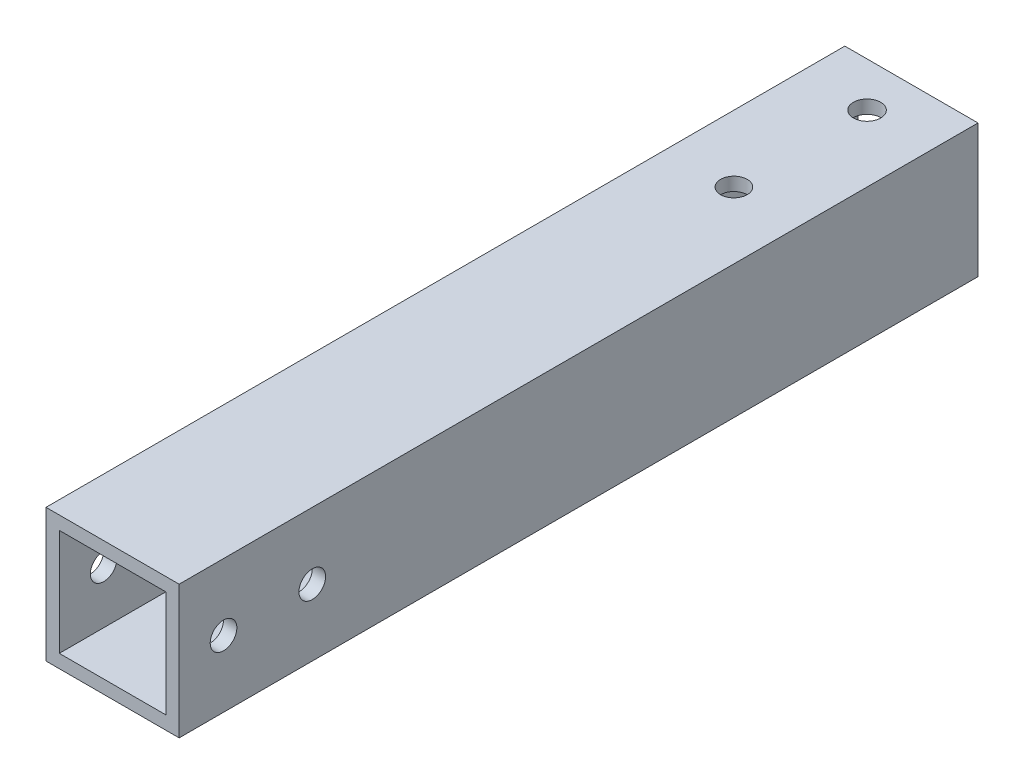
ISO-10303-21;
HEADER;
FILE_DESCRIPTION(('STEP AP214'),'2;1');
FILE_NAME('part.step','',(''),(''),'','','');
FILE_SCHEMA(('AUTOMOTIVE_DESIGN { 1 0 10303 214 1 1 1 1 }'));
ENDSEC;
DATA;
#1=APPLICATION_CONTEXT('core data for automotive mechanical design processes');
#2=APPLICATION_PROTOCOL_DEFINITION('international standard','automotive_design',2000,#1);
#3=PRODUCT_CONTEXT('',#1,'mechanical');
#4=PRODUCT('Part','Part','',(#3));
#5=PRODUCT_RELATED_PRODUCT_CATEGORY('part','',(#4));
#6=PRODUCT_DEFINITION_FORMATION('','',#4);
#7=PRODUCT_DEFINITION_CONTEXT('part definition',#1,'design');
#8=PRODUCT_DEFINITION('design','',#6,#7);
#9=PRODUCT_DEFINITION_SHAPE('','',#8);
#10=(LENGTH_UNIT() NAMED_UNIT(*) SI_UNIT(.MILLI.,.METRE.));
#11=(NAMED_UNIT(*) PLANE_ANGLE_UNIT() SI_UNIT($,.RADIAN.));
#12=(NAMED_UNIT(*) SI_UNIT($,.STERADIAN.) SOLID_ANGLE_UNIT());
#13=UNCERTAINTY_MEASURE_WITH_UNIT(LENGTH_MEASURE(1.E-05),#10,'distance_accuracy_value','');
#14=(GEOMETRIC_REPRESENTATION_CONTEXT(3) GLOBAL_UNCERTAINTY_ASSIGNED_CONTEXT((#13)) GLOBAL_UNIT_ASSIGNED_CONTEXT((#10,
#11,#12)) REPRESENTATION_CONTEXT('',''));
#15=CARTESIAN_POINT('',(0.,0.,0.));
#16=DIRECTION('',(0.,0.,1.));
#17=DIRECTION('',(1.,0.,0.));
#18=AXIS2_PLACEMENT_3D('',#15,#16,#17);
#19=CARTESIAN_POINT('',(7.5,-7.49999999999999,90.));
#20=DIRECTION('',(-1.,0.,0.));
#21=DIRECTION('',(0.,0.,1.));
#22=AXIS2_PLACEMENT_3D('',#19,#20,#21);
#23=PLANE('',#22);
#24=CARTESIAN_POINT('',(7.5,0.,75.));
#25=DIRECTION('',(1.,0.,0.));
#26=DIRECTION('',(0.,0.,-1.));
#27=AXIS2_PLACEMENT_3D('',#24,#25,#26);
#28=CIRCLE('',#27,1.5);
#29=CARTESIAN_POINT('',(7.5,0.,73.5));
#30=VERTEX_POINT('',#29);
#31=EDGE_CURVE('E176',#30,#30,#28,.T.);
#32=ORIENTED_EDGE('',*,*,#31,.F.);
#33=EDGE_LOOP('',(#32));
#34=FACE_BOUND('',#33,.T.);
#35=CARTESIAN_POINT('',(7.5,0.,85.));
#36=DIRECTION('',(1.,0.,0.));
#37=DIRECTION('',(0.,0.,-1.));
#38=AXIS2_PLACEMENT_3D('',#35,#36,#37);
#39=CIRCLE('',#38,1.5);
#40=CARTESIAN_POINT('',(7.5,0.,83.5));
#41=VERTEX_POINT('',#40);
#42=EDGE_CURVE('E195',#41,#41,#39,.T.);
#43=ORIENTED_EDGE('',*,*,#42,.F.);
#44=EDGE_LOOP('',(#43));
#45=FACE_BOUND('',#44,.T.);
#46=DIRECTION('',(0.,1.,0.));
#47=VECTOR('',#46,1.);
#48=CARTESIAN_POINT('',(7.5,-7.49999999999999,0.));
#49=LINE('',#48,#47);
#50=CARTESIAN_POINT('',(7.5,-7.49999999999999,0.));
#51=VERTEX_POINT('',#50);
#52=CARTESIAN_POINT('',(7.5,7.50000000000001,0.));
#53=VERTEX_POINT('',#52);
#54=EDGE_CURVE('E132',#51,#53,#49,.T.);
#55=ORIENTED_EDGE('',*,*,#54,.T.);
#56=DIRECTION('',(0.,0.,-1.));
#57=VECTOR('',#56,1.);
#58=CARTESIAN_POINT('',(7.5,7.50000000000001,90.));
#59=LINE('',#58,#57);
#60=CARTESIAN_POINT('',(7.5,7.50000000000001,90.));
#61=VERTEX_POINT('',#60);
#62=EDGE_CURVE('E11',#61,#53,#59,.T.);
#63=ORIENTED_EDGE('',*,*,#62,.F.);
#64=DIRECTION('',(0.,1.,0.));
#65=VECTOR('',#64,1.);
#66=CARTESIAN_POINT('',(7.5,-7.49999999999999,90.));
#67=LINE('',#66,#65);
#68=CARTESIAN_POINT('',(7.5,-7.49999999999999,90.));
#69=VERTEX_POINT('',#68);
#70=EDGE_CURVE('E136',#69,#61,#67,.T.);
#71=ORIENTED_EDGE('',*,*,#70,.F.);
#72=DIRECTION('',(0.,0.,-1.));
#73=VECTOR('',#72,1.);
#74=CARTESIAN_POINT('',(7.5,-7.49999999999999,90.));
#75=LINE('',#74,#73);
#76=EDGE_CURVE('E146',#69,#51,#75,.T.);
#77=ORIENTED_EDGE('',*,*,#76,.T.);
#78=EDGE_LOOP('',(#55,#63,#71,#77));
#79=FACE_BOUND('',#78,.T.);
#80=ADVANCED_FACE('F30',(#34,#45,#79),#23,.F.);
#81=CARTESIAN_POINT('',(-7.5,7.50000000000001,90.));
#82=DIRECTION('',(0.,-1.,0.));
#83=DIRECTION('',(0.,0.,-1.));
#84=AXIS2_PLACEMENT_3D('',#81,#82,#83);
#85=PLANE('',#84);
#86=CARTESIAN_POINT('',(1.85615411929518E-13,7.50000000000001,4.99999999999972));
#87=DIRECTION('',(0.,1.,0.));
#88=DIRECTION('',(0.,0.,1.));
#89=AXIS2_PLACEMENT_3D('',#86,#87,#88);
#90=CIRCLE('',#89,1.53877849812308);
#91=CARTESIAN_POINT('',(1.85615411929518E-13,7.50000000000001,6.5387784981228));
#92=VERTEX_POINT('',#91);
#93=EDGE_CURVE('E286',#92,#92,#90,.T.);
#94=ORIENTED_EDGE('',*,*,#93,.F.);
#95=EDGE_LOOP('',(#94));
#96=FACE_BOUND('',#95,.T.);
#97=CARTESIAN_POINT('',(1.82145964977565E-13,7.50000000000001,19.9999999999997));
#98=DIRECTION('',(0.,1.,0.));
#99=DIRECTION('',(0.,0.,1.));
#100=AXIS2_PLACEMENT_3D('',#97,#98,#99);
#101=CIRCLE('',#100,1.5);
#102=CARTESIAN_POINT('',(1.82145964977565E-13,7.50000000000001,21.4999999999997));
#103=VERTEX_POINT('',#102);
#104=EDGE_CURVE('E179',#103,#103,#101,.T.);
#105=ORIENTED_EDGE('',*,*,#104,.F.);
#106=EDGE_LOOP('',(#105));
#107=FACE_BOUND('',#106,.T.);
#108=DIRECTION('',(-1.,0.,0.));
#109=VECTOR('',#108,1.);
#110=CARTESIAN_POINT('',(-7.5,7.50000000000001,0.));
#111=LINE('',#110,#109);
#112=CARTESIAN_POINT('',(-7.5,7.50000000000001,0.));
#113=VERTEX_POINT('',#112);
#114=EDGE_CURVE('E149',#53,#113,#111,.T.);
#115=ORIENTED_EDGE('',*,*,#114,.T.);
#116=DIRECTION('',(0.,0.,-1.));
#117=VECTOR('',#116,1.);
#118=CARTESIAN_POINT('',(-7.5,7.50000000000001,90.));
#119=LINE('',#118,#117);
#120=CARTESIAN_POINT('',(-7.5,7.50000000000001,90.));
#121=VERTEX_POINT('',#120);
#122=EDGE_CURVE('E38',#121,#113,#119,.T.);
#123=ORIENTED_EDGE('',*,*,#122,.F.);
#124=DIRECTION('',(-1.,0.,0.));
#125=VECTOR('',#124,1.);
#126=CARTESIAN_POINT('',(-7.5,7.50000000000001,90.));
#127=LINE('',#126,#125);
#128=EDGE_CURVE('E139',#61,#121,#127,.T.);
#129=ORIENTED_EDGE('',*,*,#128,.F.);
#130=ORIENTED_EDGE('',*,*,#62,.T.);
#131=EDGE_LOOP('',(#115,#123,#129,#130));
#132=FACE_BOUND('',#131,.T.);
#133=ADVANCED_FACE('F205',(#96,#107,#132),#85,.F.);
#134=CARTESIAN_POINT('',(-7.5,-7.49999999999999,90.));
#135=DIRECTION('',(1.,0.,0.));
#136=DIRECTION('',(0.,0.,-1.));
#137=AXIS2_PLACEMENT_3D('',#134,#135,#136);
#138=PLANE('',#137);
#139=CARTESIAN_POINT('',(-7.5,0.,75.));
#140=DIRECTION('',(1.,0.,0.));
#141=DIRECTION('',(0.,0.,-1.));
#142=AXIS2_PLACEMENT_3D('',#139,#140,#141);
#143=CIRCLE('',#142,1.5);
#144=CARTESIAN_POINT('',(-7.5,0.,73.5));
#145=VERTEX_POINT('',#144);
#146=EDGE_CURVE('E168',#145,#145,#143,.T.);
#147=ORIENTED_EDGE('',*,*,#146,.T.);
#148=EDGE_LOOP('',(#147));
#149=FACE_BOUND('',#148,.T.);
#150=CARTESIAN_POINT('',(-7.5,0.,85.));
#151=DIRECTION('',(1.,0.,0.));
#152=DIRECTION('',(0.,0.,-1.));
#153=AXIS2_PLACEMENT_3D('',#150,#151,#152);
#154=CIRCLE('',#153,1.5);
#155=CARTESIAN_POINT('',(-7.5,0.,83.5));
#156=VERTEX_POINT('',#155);
#157=EDGE_CURVE('E164',#156,#156,#154,.T.);
#158=ORIENTED_EDGE('',*,*,#157,.T.);
#159=EDGE_LOOP('',(#158));
#160=FACE_BOUND('',#159,.T.);
#161=DIRECTION('',(0.,-1.,0.));
#162=VECTOR('',#161,1.);
#163=CARTESIAN_POINT('',(-7.5,-7.49999999999999,0.));
#164=LINE('',#163,#162);
#165=CARTESIAN_POINT('',(-7.5,-7.49999999999999,0.));
#166=VERTEX_POINT('',#165);
#167=EDGE_CURVE('E151',#113,#166,#164,.T.);
#168=ORIENTED_EDGE('',*,*,#167,.T.);
#169=DIRECTION('',(0.,0.,-1.));
#170=VECTOR('',#169,1.);
#171=CARTESIAN_POINT('',(-7.5,-7.49999999999999,90.));
#172=LINE('',#171,#170);
#173=CARTESIAN_POINT('',(-7.5,-7.49999999999999,90.));
#174=VERTEX_POINT('',#173);
#175=EDGE_CURVE('E156',#174,#166,#172,.T.);
#176=ORIENTED_EDGE('',*,*,#175,.F.);
#177=DIRECTION('',(0.,-1.,0.));
#178=VECTOR('',#177,1.);
#179=CARTESIAN_POINT('',(-7.5,-7.49999999999999,90.));
#180=LINE('',#179,#178);
#181=EDGE_CURVE('E142',#121,#174,#180,.T.);
#182=ORIENTED_EDGE('',*,*,#181,.F.);
#183=ORIENTED_EDGE('',*,*,#122,.T.);
#184=EDGE_LOOP('',(#168,#176,#182,#183));
#185=FACE_BOUND('',#184,.T.);
#186=ADVANCED_FACE('F223',(#149,#160,#185),#138,.F.);
#187=CARTESIAN_POINT('',(-7.5,-7.49999999999999,90.));
#188=DIRECTION('',(0.,1.,0.));
#189=DIRECTION('',(0.,0.,1.));
#190=AXIS2_PLACEMENT_3D('',#187,#188,#189);
#191=PLANE('',#190);
#192=CARTESIAN_POINT('',(1.85615411929518E-13,-7.49999999999999,4.99999999999972));
#193=DIRECTION('',(0.,1.,0.));
#194=DIRECTION('',(0.,0.,1.));
#195=AXIS2_PLACEMENT_3D('',#192,#193,#194);
#196=CIRCLE('',#195,1.53877849812308);
#197=CARTESIAN_POINT('',(1.85615411929518E-13,-7.49999999999999,6.5387784981228));
#198=VERTEX_POINT('',#197);
#199=EDGE_CURVE('E281',#198,#198,#196,.T.);
#200=ORIENTED_EDGE('',*,*,#199,.T.);
#201=EDGE_LOOP('',(#200));
#202=FACE_BOUND('',#201,.T.);
#203=CARTESIAN_POINT('',(1.82145964977565E-13,-7.49999999999999,19.9999999999997));
#204=DIRECTION('',(0.,1.,0.));
#205=DIRECTION('',(0.,0.,1.));
#206=AXIS2_PLACEMENT_3D('',#203,#204,#205);
#207=CIRCLE('',#206,1.5);
#208=CARTESIAN_POINT('',(1.82145964977565E-13,-7.49999999999999,21.4999999999997));
#209=VERTEX_POINT('',#208);
#210=EDGE_CURVE('E172',#209,#209,#207,.T.);
#211=ORIENTED_EDGE('',*,*,#210,.T.);
#212=EDGE_LOOP('',(#211));
#213=FACE_BOUND('',#212,.T.);
#214=DIRECTION('',(1.,0.,0.));
#215=VECTOR('',#214,1.);
#216=CARTESIAN_POINT('',(-7.5,-7.49999999999999,0.));
#217=LINE('',#216,#215);
#218=EDGE_CURVE('E140',#166,#51,#217,.T.);
#219=ORIENTED_EDGE('',*,*,#218,.T.);
#220=ORIENTED_EDGE('',*,*,#76,.F.);
#221=DIRECTION('',(1.,0.,0.));
#222=VECTOR('',#221,1.);
#223=CARTESIAN_POINT('',(-7.5,-7.49999999999999,90.));
#224=LINE('',#223,#222);
#225=EDGE_CURVE('E144',#174,#69,#224,.T.);
#226=ORIENTED_EDGE('',*,*,#225,.F.);
#227=ORIENTED_EDGE('',*,*,#175,.T.);
#228=EDGE_LOOP('',(#219,#220,#226,#227));
#229=FACE_BOUND('',#228,.T.);
#230=ADVANCED_FACE('F221',(#202,#213,#229),#191,.F.);
#231=CARTESIAN_POINT('',(7.5,7.50000000000001,90.));
#232=DIRECTION('',(0.,0.,-1.));
#233=DIRECTION('',(-1.,0.,0.));
#234=AXIS2_PLACEMENT_3D('',#231,#232,#233);
#235=PLANE('',#234);
#236=DIRECTION('',(-1.,0.,0.));
#237=VECTOR('',#236,1.);
#238=CARTESIAN_POINT('',(-6.,6.00000000000001,90.));
#239=LINE('',#238,#237);
#240=CARTESIAN_POINT('',(6.,6.00000000000001,90.));
#241=VERTEX_POINT('',#240);
#242=CARTESIAN_POINT('',(-6.,6.00000000000001,90.));
#243=VERTEX_POINT('',#242);
#244=EDGE_CURVE('E126',#241,#243,#239,.T.);
#245=ORIENTED_EDGE('',*,*,#244,.F.);
#246=DIRECTION('',(0.,1.,0.));
#247=VECTOR('',#246,1.);
#248=CARTESIAN_POINT('',(6.,-6.00000000000001,90.));
#249=LINE('',#248,#247);
#250=CARTESIAN_POINT('',(6.,-6.00000000000001,90.));
#251=VERTEX_POINT('',#250);
#252=EDGE_CURVE('E46',#251,#241,#249,.T.);
#253=ORIENTED_EDGE('',*,*,#252,.F.);
#254=DIRECTION('',(1.,0.,0.));
#255=VECTOR('',#254,1.);
#256=CARTESIAN_POINT('',(-6.,-6.00000000000001,90.));
#257=LINE('',#256,#255);
#258=CARTESIAN_POINT('',(-6.,-6.00000000000001,90.));
#259=VERTEX_POINT('',#258);
#260=EDGE_CURVE('E114',#259,#251,#257,.T.);
#261=ORIENTED_EDGE('',*,*,#260,.F.);
#262=DIRECTION('',(0.,-1.,0.));
#263=VECTOR('',#262,1.);
#264=CARTESIAN_POINT('',(-6.,-6.00000000000001,90.));
#265=LINE('',#264,#263);
#266=EDGE_CURVE('E117',#243,#259,#265,.T.);
#267=ORIENTED_EDGE('',*,*,#266,.F.);
#268=EDGE_LOOP('',(#245,#253,#261,#267));
#269=FACE_BOUND('',#268,.T.);
#270=ORIENTED_EDGE('',*,*,#70,.T.);
#271=ORIENTED_EDGE('',*,*,#128,.T.);
#272=ORIENTED_EDGE('',*,*,#181,.T.);
#273=ORIENTED_EDGE('',*,*,#225,.T.);
#274=EDGE_LOOP('',(#270,#271,#272,#273));
#275=FACE_BOUND('',#274,.T.);
#276=ADVANCED_FACE('F217',(#269,#275),#235,.F.);
#277=CARTESIAN_POINT('',(7.5,7.50000000000001,0.));
#278=DIRECTION('',(0.,0.,-1.));
#279=DIRECTION('',(-1.,0.,0.));
#280=AXIS2_PLACEMENT_3D('',#277,#278,#279);
#281=PLANE('',#280);
#282=DIRECTION('',(0.,1.,0.));
#283=VECTOR('',#282,1.);
#284=CARTESIAN_POINT('',(6.,-6.00000000000001,0.));
#285=LINE('',#284,#283);
#286=CARTESIAN_POINT('',(6.,-6.00000000000001,0.));
#287=VERTEX_POINT('',#286);
#288=CARTESIAN_POINT('',(6.,6.00000000000001,0.));
#289=VERTEX_POINT('',#288);
#290=EDGE_CURVE('E98',#287,#289,#285,.T.);
#291=ORIENTED_EDGE('',*,*,#290,.T.);
#292=DIRECTION('',(-1.,0.,0.));
#293=VECTOR('',#292,1.);
#294=CARTESIAN_POINT('',(-6.,6.00000000000001,0.));
#295=LINE('',#294,#293);
#296=CARTESIAN_POINT('',(-6.,6.00000000000001,0.));
#297=VERTEX_POINT('',#296);
#298=EDGE_CURVE('E107',#289,#297,#295,.T.);
#299=ORIENTED_EDGE('',*,*,#298,.T.);
#300=DIRECTION('',(0.,-1.,0.));
#301=VECTOR('',#300,1.);
#302=CARTESIAN_POINT('',(-6.,-6.00000000000001,0.));
#303=LINE('',#302,#301);
#304=CARTESIAN_POINT('',(-6.,-6.00000000000001,0.));
#305=VERTEX_POINT('',#304);
#306=EDGE_CURVE('E54',#297,#305,#303,.T.);
#307=ORIENTED_EDGE('',*,*,#306,.T.);
#308=DIRECTION('',(1.,0.,0.));
#309=VECTOR('',#308,1.);
#310=CARTESIAN_POINT('',(-6.,-6.00000000000001,0.));
#311=LINE('',#310,#309);
#312=EDGE_CURVE('E104',#305,#287,#311,.T.);
#313=ORIENTED_EDGE('',*,*,#312,.T.);
#314=EDGE_LOOP('',(#291,#299,#307,#313));
#315=FACE_BOUND('',#314,.T.);
#316=ORIENTED_EDGE('',*,*,#54,.F.);
#317=ORIENTED_EDGE('',*,*,#218,.F.);
#318=ORIENTED_EDGE('',*,*,#167,.F.);
#319=ORIENTED_EDGE('',*,*,#114,.F.);
#320=EDGE_LOOP('',(#316,#317,#318,#319));
#321=FACE_BOUND('',#320,.T.);
#322=ADVANCED_FACE('F111',(#315,#321),#281,.T.);
#323=CARTESIAN_POINT('',(6.,-6.00000000000001,0.));
#324=DIRECTION('',(1.,0.,0.));
#325=DIRECTION('',(0.,0.,-1.));
#326=AXIS2_PLACEMENT_3D('',#323,#324,#325);
#327=PLANE('',#326);
#328=CARTESIAN_POINT('',(6.,0.,75.));
#329=DIRECTION('',(1.,0.,0.));
#330=DIRECTION('',(0.,0.,-1.));
#331=AXIS2_PLACEMENT_3D('',#328,#329,#330);
#332=CIRCLE('',#331,1.5);
#333=CARTESIAN_POINT('',(6.,0.,73.5));
#334=VERTEX_POINT('',#333);
#335=EDGE_CURVE('E167',#334,#334,#332,.T.);
#336=ORIENTED_EDGE('',*,*,#335,.T.);
#337=EDGE_LOOP('',(#336));
#338=FACE_BOUND('',#337,.T.);
#339=CARTESIAN_POINT('',(6.,0.,85.));
#340=DIRECTION('',(1.,0.,0.));
#341=DIRECTION('',(0.,0.,-1.));
#342=AXIS2_PLACEMENT_3D('',#339,#340,#341);
#343=CIRCLE('',#342,1.5);
#344=CARTESIAN_POINT('',(6.,0.,83.5));
#345=VERTEX_POINT('',#344);
#346=EDGE_CURVE('E120',#345,#345,#343,.T.);
#347=ORIENTED_EDGE('',*,*,#346,.T.);
#348=EDGE_LOOP('',(#347));
#349=FACE_BOUND('',#348,.T.);
#350=ORIENTED_EDGE('',*,*,#252,.T.);
#351=DIRECTION('',(0.,0.,1.));
#352=VECTOR('',#351,1.);
#353=CARTESIAN_POINT('',(6.,6.00000000000001,0.));
#354=LINE('',#353,#352);
#355=EDGE_CURVE('E94',#289,#241,#354,.T.);
#356=ORIENTED_EDGE('',*,*,#355,.F.);
#357=ORIENTED_EDGE('',*,*,#290,.F.);
#358=DIRECTION('',(0.,0.,1.));
#359=VECTOR('',#358,1.);
#360=CARTESIAN_POINT('',(6.,-6.00000000000001,0.));
#361=LINE('',#360,#359);
#362=EDGE_CURVE('E130',#287,#251,#361,.T.);
#363=ORIENTED_EDGE('',*,*,#362,.T.);
#364=EDGE_LOOP('',(#350,#356,#357,#363));
#365=FACE_BOUND('',#364,.T.);
#366=ADVANCED_FACE('F96',(#338,#349,#365),#327,.F.);
#367=CARTESIAN_POINT('',(-6.,-6.00000000000001,0.));
#368=DIRECTION('',(0.,-1.,0.));
#369=DIRECTION('',(0.,0.,-1.));
#370=AXIS2_PLACEMENT_3D('',#367,#368,#369);
#371=PLANE('',#370);
#372=CARTESIAN_POINT('',(1.85615411929518E-13,-6.00000000000001,4.99999999999972));
#373=DIRECTION('',(0.,-1.,0.));
#374=DIRECTION('',(0.,0.,-1.));
#375=AXIS2_PLACEMENT_3D('',#372,#373,#374);
#376=CIRCLE('',#375,1.53877849812308);
#377=CARTESIAN_POINT('',(1.85615411929518E-13,-6.00000000000001,3.46122150187664));
#378=VERTEX_POINT('',#377);
#379=EDGE_CURVE('E184',#378,#378,#376,.T.);
#380=ORIENTED_EDGE('',*,*,#379,.T.);
#381=EDGE_LOOP('',(#380));
#382=FACE_BOUND('',#381,.T.);
#383=CARTESIAN_POINT('',(1.82145964977565E-13,-6.00000000000001,19.9999999999997));
#384=DIRECTION('',(0.,-1.,0.));
#385=DIRECTION('',(0.,0.,-1.));
#386=AXIS2_PLACEMENT_3D('',#383,#384,#385);
#387=CIRCLE('',#386,1.5);
#388=CARTESIAN_POINT('',(1.82145964977565E-13,-6.00000000000001,18.4999999999997));
#389=VERTEX_POINT('',#388);
#390=EDGE_CURVE('E171',#389,#389,#387,.T.);
#391=ORIENTED_EDGE('',*,*,#390,.T.);
#392=EDGE_LOOP('',(#391));
#393=FACE_BOUND('',#392,.T.);
#394=ORIENTED_EDGE('',*,*,#260,.T.);
#395=ORIENTED_EDGE('',*,*,#362,.F.);
#396=ORIENTED_EDGE('',*,*,#312,.F.);
#397=DIRECTION('',(0.,0.,1.));
#398=VECTOR('',#397,1.);
#399=CARTESIAN_POINT('',(-6.,-6.00000000000001,0.));
#400=LINE('',#399,#398);
#401=EDGE_CURVE('E133',#305,#259,#400,.T.);
#402=ORIENTED_EDGE('',*,*,#401,.T.);
#403=EDGE_LOOP('',(#394,#395,#396,#402));
#404=FACE_BOUND('',#403,.T.);
#405=ADVANCED_FACE('F245',(#382,#393,#404),#371,.F.);
#406=CARTESIAN_POINT('',(-6.,-6.00000000000001,0.));
#407=DIRECTION('',(-1.,0.,0.));
#408=DIRECTION('',(0.,0.,1.));
#409=AXIS2_PLACEMENT_3D('',#406,#407,#408);
#410=PLANE('',#409);
#411=CARTESIAN_POINT('',(-6.,0.,75.));
#412=DIRECTION('',(-1.,0.,0.));
#413=DIRECTION('',(0.,0.,1.));
#414=AXIS2_PLACEMENT_3D('',#411,#412,#413);
#415=CIRCLE('',#414,1.5);
#416=CARTESIAN_POINT('',(-6.,0.,76.5));
#417=VERTEX_POINT('',#416);
#418=EDGE_CURVE('E165',#417,#417,#415,.T.);
#419=ORIENTED_EDGE('',*,*,#418,.T.);
#420=EDGE_LOOP('',(#419));
#421=FACE_BOUND('',#420,.T.);
#422=CARTESIAN_POINT('',(-6.,0.,85.));
#423=DIRECTION('',(-1.,0.,0.));
#424=DIRECTION('',(0.,0.,1.));
#425=AXIS2_PLACEMENT_3D('',#422,#423,#424);
#426=CIRCLE('',#425,1.5);
#427=CARTESIAN_POINT('',(-6.,0.,86.5));
#428=VERTEX_POINT('',#427);
#429=EDGE_CURVE('E161',#428,#428,#426,.T.);
#430=ORIENTED_EDGE('',*,*,#429,.T.);
#431=EDGE_LOOP('',(#430));
#432=FACE_BOUND('',#431,.T.);
#433=ORIENTED_EDGE('',*,*,#266,.T.);
#434=ORIENTED_EDGE('',*,*,#401,.F.);
#435=ORIENTED_EDGE('',*,*,#306,.F.);
#436=DIRECTION('',(0.,0.,1.));
#437=VECTOR('',#436,1.);
#438=CARTESIAN_POINT('',(-6.,6.00000000000001,0.));
#439=LINE('',#438,#437);
#440=EDGE_CURVE('E103',#297,#243,#439,.T.);
#441=ORIENTED_EDGE('',*,*,#440,.T.);
#442=EDGE_LOOP('',(#433,#434,#435,#441));
#443=FACE_BOUND('',#442,.T.);
#444=ADVANCED_FACE('F250',(#421,#432,#443),#410,.F.);
#445=CARTESIAN_POINT('',(-6.,6.00000000000001,0.));
#446=DIRECTION('',(0.,1.,0.));
#447=DIRECTION('',(0.,0.,1.));
#448=AXIS2_PLACEMENT_3D('',#445,#446,#447);
#449=PLANE('',#448);
#450=CARTESIAN_POINT('',(1.85615411929518E-13,6.00000000000001,4.99999999999972));
#451=DIRECTION('',(0.,1.,0.));
#452=DIRECTION('',(0.,0.,1.));
#453=AXIS2_PLACEMENT_3D('',#450,#451,#452);
#454=CIRCLE('',#453,1.53877849812308);
#455=CARTESIAN_POINT('',(1.85615411929518E-13,6.00000000000001,6.5387784981228));
#456=VERTEX_POINT('',#455);
#457=EDGE_CURVE('E33',#456,#456,#454,.T.);
#458=ORIENTED_EDGE('',*,*,#457,.T.);
#459=EDGE_LOOP('',(#458));
#460=FACE_BOUND('',#459,.T.);
#461=CARTESIAN_POINT('',(1.82145964977565E-13,6.00000000000001,19.9999999999997));
#462=DIRECTION('',(0.,1.,0.));
#463=DIRECTION('',(0.,0.,1.));
#464=AXIS2_PLACEMENT_3D('',#461,#462,#463);
#465=CIRCLE('',#464,1.5);
#466=CARTESIAN_POINT('',(1.82145964977565E-13,6.00000000000001,21.4999999999997));
#467=VERTEX_POINT('',#466);
#468=EDGE_CURVE('E169',#467,#467,#465,.T.);
#469=ORIENTED_EDGE('',*,*,#468,.T.);
#470=EDGE_LOOP('',(#469));
#471=FACE_BOUND('',#470,.T.);
#472=ORIENTED_EDGE('',*,*,#244,.T.);
#473=ORIENTED_EDGE('',*,*,#440,.F.);
#474=ORIENTED_EDGE('',*,*,#298,.F.);
#475=ORIENTED_EDGE('',*,*,#355,.T.);
#476=EDGE_LOOP('',(#472,#473,#474,#475));
#477=FACE_BOUND('',#476,.T.);
#478=ADVANCED_FACE('F108',(#460,#471,#477),#449,.F.);
#479=CARTESIAN_POINT('',(-7.5,0.,85.));
#480=DIRECTION('',(1.,0.,0.));
#481=DIRECTION('',(0.,0.,-1.));
#482=AXIS2_PLACEMENT_3D('',#479,#480,#481);
#483=CYLINDRICAL_SURFACE('',#482,1.5);
#484=ORIENTED_EDGE('',*,*,#157,.F.);
#485=EDGE_LOOP('',(#484));
#486=FACE_BOUND('',#485,.T.);
#487=ORIENTED_EDGE('',*,*,#429,.F.);
#488=EDGE_LOOP('',(#487));
#489=FACE_BOUND('',#488,.T.);
#490=ADVANCED_FACE('F249',(#486,#489),#483,.F.);
#491=ORIENTED_EDGE('',*,*,#42,.T.);
#492=EDGE_LOOP('',(#491));
#493=FACE_BOUND('',#492,.T.);
#494=ORIENTED_EDGE('',*,*,#346,.F.);
#495=EDGE_LOOP('',(#494));
#496=FACE_BOUND('',#495,.T.);
#497=ADVANCED_FACE('F200',(#493,#496),#483,.F.);
#498=CARTESIAN_POINT('',(-7.5,0.,75.));
#499=DIRECTION('',(1.,0.,0.));
#500=DIRECTION('',(0.,0.,-1.));
#501=AXIS2_PLACEMENT_3D('',#498,#499,#500);
#502=CYLINDRICAL_SURFACE('',#501,1.5);
#503=ORIENTED_EDGE('',*,*,#146,.F.);
#504=EDGE_LOOP('',(#503));
#505=FACE_BOUND('',#504,.T.);
#506=ORIENTED_EDGE('',*,*,#418,.F.);
#507=EDGE_LOOP('',(#506));
#508=FACE_BOUND('',#507,.T.);
#509=ADVANCED_FACE('F260',(#505,#508),#502,.F.);
#510=ORIENTED_EDGE('',*,*,#31,.T.);
#511=EDGE_LOOP('',(#510));
#512=FACE_BOUND('',#511,.T.);
#513=ORIENTED_EDGE('',*,*,#335,.F.);
#514=EDGE_LOOP('',(#513));
#515=FACE_BOUND('',#514,.T.);
#516=ADVANCED_FACE('F261',(#512,#515),#502,.F.);
#517=CARTESIAN_POINT('',(1.82145964977565E-13,-7.49999999999999,19.9999999999997));
#518=DIRECTION('',(0.,1.,0.));
#519=DIRECTION('',(0.,0.,1.));
#520=AXIS2_PLACEMENT_3D('',#517,#518,#519);
#521=CYLINDRICAL_SURFACE('',#520,1.5);
#522=ORIENTED_EDGE('',*,*,#104,.T.);
#523=EDGE_LOOP('',(#522));
#524=FACE_BOUND('',#523,.T.);
#525=ORIENTED_EDGE('',*,*,#468,.F.);
#526=EDGE_LOOP('',(#525));
#527=FACE_BOUND('',#526,.T.);
#528=ADVANCED_FACE('F264',(#524,#527),#521,.F.);
#529=ORIENTED_EDGE('',*,*,#210,.F.);
#530=EDGE_LOOP('',(#529));
#531=FACE_BOUND('',#530,.T.);
#532=ORIENTED_EDGE('',*,*,#390,.F.);
#533=EDGE_LOOP('',(#532));
#534=FACE_BOUND('',#533,.T.);
#535=ADVANCED_FACE('F266',(#531,#534),#521,.F.);
#536=CARTESIAN_POINT('',(1.85615411929518E-13,-7.49999999999999,4.99999999999972));
#537=DIRECTION('',(0.,1.,0.));
#538=DIRECTION('',(0.,0.,1.));
#539=AXIS2_PLACEMENT_3D('',#536,#537,#538);
#540=CYLINDRICAL_SURFACE('',#539,1.53877849812308);
#541=ORIENTED_EDGE('',*,*,#93,.T.);
#542=EDGE_LOOP('',(#541));
#543=FACE_BOUND('',#542,.T.);
#544=ORIENTED_EDGE('',*,*,#457,.F.);
#545=EDGE_LOOP('',(#544));
#546=FACE_BOUND('',#545,.T.);
#547=ADVANCED_FACE('F269',(#543,#546),#540,.F.);
#548=ORIENTED_EDGE('',*,*,#199,.F.);
#549=EDGE_LOOP('',(#548));
#550=FACE_BOUND('',#549,.T.);
#551=ORIENTED_EDGE('',*,*,#379,.F.);
#552=EDGE_LOOP('',(#551));
#553=FACE_BOUND('',#552,.T.);
#554=ADVANCED_FACE('F271',(#550,#553),#540,.F.);
#555=CLOSED_SHELL('',(#80,#133,#186,#230,#276,#322,#366,#405,#444,#478,#490,#497,#509,#516,#528,
#535,#547,#554));
#556=MANIFOLD_SOLID_BREP('B2',#555);
#557=ADVANCED_BREP_SHAPE_REPRESENTATION('',(#18,#556),#14);
#558=SHAPE_DEFINITION_REPRESENTATION(#9,#557);
ENDSEC;
END-ISO-10303-21;
